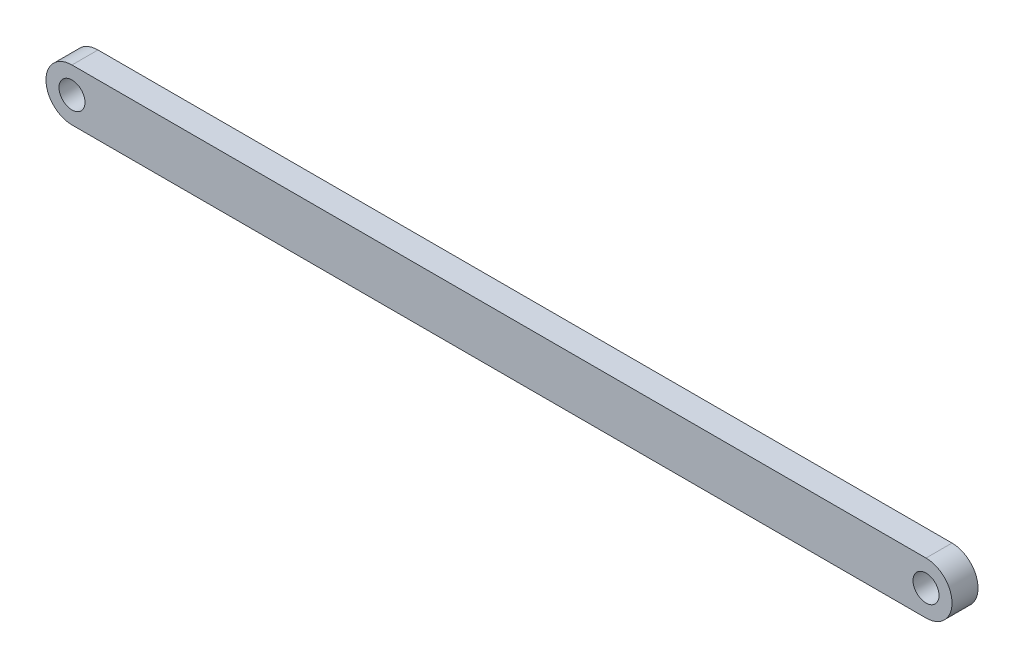
ISO-10303-21;
HEADER;
FILE_DESCRIPTION(('STEP AP214'),'2;1');
FILE_NAME('part.step','',(''),(''),'','','');
FILE_SCHEMA(('AUTOMOTIVE_DESIGN { 1 0 10303 214 1 1 1 1 }'));
ENDSEC;
DATA;
#1=APPLICATION_CONTEXT('core data for automotive mechanical design processes');
#2=APPLICATION_PROTOCOL_DEFINITION('international standard','automotive_design',2000,#1);
#3=PRODUCT_CONTEXT('',#1,'mechanical');
#4=PRODUCT('Part','Part','',(#3));
#5=PRODUCT_RELATED_PRODUCT_CATEGORY('part','',(#4));
#6=PRODUCT_DEFINITION_FORMATION('','',#4);
#7=PRODUCT_DEFINITION_CONTEXT('part definition',#1,'design');
#8=PRODUCT_DEFINITION('design','',#6,#7);
#9=PRODUCT_DEFINITION_SHAPE('','',#8);
#10=(LENGTH_UNIT() NAMED_UNIT(*) SI_UNIT(.MILLI.,.METRE.));
#11=(NAMED_UNIT(*) PLANE_ANGLE_UNIT() SI_UNIT($,.RADIAN.));
#12=(NAMED_UNIT(*) SI_UNIT($,.STERADIAN.) SOLID_ANGLE_UNIT());
#13=UNCERTAINTY_MEASURE_WITH_UNIT(LENGTH_MEASURE(1.E-05),#10,'distance_accuracy_value','');
#14=(GEOMETRIC_REPRESENTATION_CONTEXT(3) GLOBAL_UNCERTAINTY_ASSIGNED_CONTEXT((#13)) GLOBAL_UNIT_ASSIGNED_CONTEXT((#10,
#11,#12)) REPRESENTATION_CONTEXT('',''));
#15=CARTESIAN_POINT('',(0.,0.,0.));
#16=DIRECTION('',(0.,0.,1.));
#17=DIRECTION('',(1.,0.,0.));
#18=AXIS2_PLACEMENT_3D('',#15,#16,#17);
#19=CARTESIAN_POINT('',(82.16,2.06151958209691,5.));
#20=DIRECTION('',(0.,0.,-1.));
#21=DIRECTION('',(-1.,0.,0.));
#22=AXIS2_PLACEMENT_3D('',#19,#20,#21);
#23=PLANE('',#22);
#24=CARTESIAN_POINT('',(82.16,2.06151958209691,5.));
#25=DIRECTION('',(0.,0.,1.));
#26=DIRECTION('',(-1.,0.,0.));
#27=AXIS2_PLACEMENT_3D('',#24,#25,#26);
#28=CIRCLE('',#27,5.00000000000002);
#29=CARTESIAN_POINT('',(82.16,-2.93848041790315,5.));
#30=VERTEX_POINT('',#29);
#31=CARTESIAN_POINT('',(82.16,7.06151958209688,5.));
#32=VERTEX_POINT('',#31);
#33=EDGE_CURVE('E96',#30,#32,#28,.T.);
#34=ORIENTED_EDGE('',*,*,#33,.T.);
#35=DIRECTION('',(-1.,0.,0.));
#36=VECTOR('',#35,1.);
#37=CARTESIAN_POINT('',(-82.16,7.06151958209688,5.));
#38=LINE('',#37,#36);
#39=CARTESIAN_POINT('',(-82.16,7.06151958209688,5.));
#40=VERTEX_POINT('',#39);
#41=EDGE_CURVE('E91',#32,#40,#38,.T.);
#42=ORIENTED_EDGE('',*,*,#41,.T.);
#43=CARTESIAN_POINT('',(-82.16,2.06151958209688,5.));
#44=DIRECTION('',(0.,0.,1.));
#45=DIRECTION('',(1.,0.,0.));
#46=AXIS2_PLACEMENT_3D('',#43,#44,#45);
#47=CIRCLE('',#46,5.00000000000003);
#48=CARTESIAN_POINT('',(-82.16,-2.93848041790315,5.));
#49=VERTEX_POINT('',#48);
#50=EDGE_CURVE('E94',#40,#49,#47,.T.);
#51=ORIENTED_EDGE('',*,*,#50,.T.);
#52=DIRECTION('',(1.,0.,0.));
#53=VECTOR('',#52,1.);
#54=CARTESIAN_POINT('',(-82.16,-2.93848041790318,5.));
#55=LINE('',#54,#53);
#56=EDGE_CURVE('E61',#49,#30,#55,.T.);
#57=ORIENTED_EDGE('',*,*,#56,.T.);
#58=EDGE_LOOP('',(#34,#42,#51,#57));
#59=FACE_BOUND('',#58,.T.);
#60=CARTESIAN_POINT('',(-82.16,2.06151958209688,5.));
#61=DIRECTION('',(0.,0.,1.));
#62=DIRECTION('',(1.,0.,0.));
#63=AXIS2_PLACEMENT_3D('',#60,#61,#62);
#64=CIRCLE('',#63,2.50000000000001);
#65=CARTESIAN_POINT('',(-79.66,2.06151958209688,5.));
#66=VERTEX_POINT('',#65);
#67=EDGE_CURVE('E116',#66,#66,#64,.T.);
#68=ORIENTED_EDGE('',*,*,#67,.F.);
#69=EDGE_LOOP('',(#68));
#70=FACE_BOUND('',#69,.T.);
#71=CARTESIAN_POINT('',(82.16,2.06151958209691,5.));
#72=DIRECTION('',(0.,0.,1.));
#73=DIRECTION('',(1.,0.,0.));
#74=AXIS2_PLACEMENT_3D('',#71,#72,#73);
#75=CIRCLE('',#74,2.50000000000001);
#76=CARTESIAN_POINT('',(84.66,2.06151958209691,5.));
#77=VERTEX_POINT('',#76);
#78=EDGE_CURVE('E138',#77,#77,#75,.T.);
#79=ORIENTED_EDGE('',*,*,#78,.F.);
#80=EDGE_LOOP('',(#79));
#81=FACE_BOUND('',#80,.T.);
#82=ADVANCED_FACE('F43',(#59,#70,#81),#23,.F.);
#83=CARTESIAN_POINT('',(82.16,2.06151958209691,0.));
#84=DIRECTION('',(0.,0.,-1.));
#85=DIRECTION('',(-1.,0.,0.));
#86=AXIS2_PLACEMENT_3D('',#83,#84,#85);
#87=PLANE('',#86);
#88=CARTESIAN_POINT('',(-82.16,2.06151958209688,0.));
#89=DIRECTION('',(0.,0.,1.));
#90=DIRECTION('',(1.,0.,0.));
#91=AXIS2_PLACEMENT_3D('',#88,#89,#90);
#92=CIRCLE('',#91,2.50000000000001);
#93=CARTESIAN_POINT('',(-79.66,2.06151958209688,0.));
#94=VERTEX_POINT('',#93);
#95=EDGE_CURVE('E134',#94,#94,#92,.T.);
#96=ORIENTED_EDGE('',*,*,#95,.T.);
#97=EDGE_LOOP('',(#96));
#98=FACE_BOUND('',#97,.T.);
#99=CARTESIAN_POINT('',(82.16,2.06151958209691,0.));
#100=DIRECTION('',(0.,0.,1.));
#101=DIRECTION('',(-1.,0.,0.));
#102=AXIS2_PLACEMENT_3D('',#99,#100,#101);
#103=CIRCLE('',#102,5.00000000000002);
#104=CARTESIAN_POINT('',(82.16,-2.93848041790315,0.));
#105=VERTEX_POINT('',#104);
#106=CARTESIAN_POINT('',(82.16,7.06151958209688,0.));
#107=VERTEX_POINT('',#106);
#108=EDGE_CURVE('E112',#105,#107,#103,.T.);
#109=ORIENTED_EDGE('',*,*,#108,.F.);
#110=DIRECTION('',(1.,0.,0.));
#111=VECTOR('',#110,1.);
#112=CARTESIAN_POINT('',(-82.16,-2.93848041790318,0.));
#113=LINE('',#112,#111);
#114=CARTESIAN_POINT('',(-82.16,-2.93848041790315,0.));
#115=VERTEX_POINT('',#114);
#116=EDGE_CURVE('E84',#115,#105,#113,.T.);
#117=ORIENTED_EDGE('',*,*,#116,.F.);
#118=CARTESIAN_POINT('',(-82.16,2.06151958209688,0.));
#119=DIRECTION('',(0.,0.,1.));
#120=DIRECTION('',(1.,0.,0.));
#121=AXIS2_PLACEMENT_3D('',#118,#119,#120);
#122=CIRCLE('',#121,5.00000000000003);
#123=CARTESIAN_POINT('',(-82.16,7.06151958209688,0.));
#124=VERTEX_POINT('',#123);
#125=EDGE_CURVE('E78',#124,#115,#122,.T.);
#126=ORIENTED_EDGE('',*,*,#125,.F.);
#127=DIRECTION('',(-1.,0.,0.));
#128=VECTOR('',#127,1.);
#129=CARTESIAN_POINT('',(-82.16,7.06151958209688,0.));
#130=LINE('',#129,#128);
#131=EDGE_CURVE('E101',#107,#124,#130,.T.);
#132=ORIENTED_EDGE('',*,*,#131,.F.);
#133=EDGE_LOOP('',(#109,#117,#126,#132));
#134=FACE_BOUND('',#133,.T.);
#135=CARTESIAN_POINT('',(82.16,2.06151958209691,0.));
#136=DIRECTION('',(0.,0.,1.));
#137=DIRECTION('',(1.,0.,0.));
#138=AXIS2_PLACEMENT_3D('',#135,#136,#137);
#139=CIRCLE('',#138,2.50000000000001);
#140=CARTESIAN_POINT('',(84.66,2.06151958209691,0.));
#141=VERTEX_POINT('',#140);
#142=EDGE_CURVE('E142',#141,#141,#139,.T.);
#143=ORIENTED_EDGE('',*,*,#142,.T.);
#144=EDGE_LOOP('',(#143));
#145=FACE_BOUND('',#144,.T.);
#146=ADVANCED_FACE('F129',(#98,#134,#145),#87,.T.);
#147=CARTESIAN_POINT('',(82.16,2.06151958209691,5.));
#148=DIRECTION('',(0.,0.,-1.));
#149=DIRECTION('',(-1.,0.,0.));
#150=AXIS2_PLACEMENT_3D('',#147,#148,#149);
#151=CYLINDRICAL_SURFACE('',#150,5.00000000000002);
#152=ORIENTED_EDGE('',*,*,#108,.T.);
#153=DIRECTION('',(0.,0.,-1.));
#154=VECTOR('',#153,1.);
#155=CARTESIAN_POINT('',(82.16,7.06151958209688,5.));
#156=LINE('',#155,#154);
#157=EDGE_CURVE('E11',#32,#107,#156,.T.);
#158=ORIENTED_EDGE('',*,*,#157,.F.);
#159=ORIENTED_EDGE('',*,*,#33,.F.);
#160=DIRECTION('',(0.,0.,-1.));
#161=VECTOR('',#160,1.);
#162=CARTESIAN_POINT('',(82.16,-2.93848041790315,5.));
#163=LINE('',#162,#161);
#164=EDGE_CURVE('E108',#30,#105,#163,.T.);
#165=ORIENTED_EDGE('',*,*,#164,.T.);
#166=EDGE_LOOP('',(#152,#158,#159,#165));
#167=FACE_BOUND('',#166,.T.);
#168=ADVANCED_FACE('F45',(#167),#151,.T.);
#169=CARTESIAN_POINT('',(-82.16,7.06151958209688,5.));
#170=DIRECTION('',(0.,-1.,0.));
#171=DIRECTION('',(0.,0.,-1.));
#172=AXIS2_PLACEMENT_3D('',#169,#170,#171);
#173=PLANE('',#172);
#174=ORIENTED_EDGE('',*,*,#131,.T.);
#175=DIRECTION('',(0.,0.,-1.));
#176=VECTOR('',#175,1.);
#177=CARTESIAN_POINT('',(-82.16,7.06151958209688,5.));
#178=LINE('',#177,#176);
#179=EDGE_CURVE('E53',#40,#124,#178,.T.);
#180=ORIENTED_EDGE('',*,*,#179,.F.);
#181=ORIENTED_EDGE('',*,*,#41,.F.);
#182=ORIENTED_EDGE('',*,*,#157,.T.);
#183=EDGE_LOOP('',(#174,#180,#181,#182));
#184=FACE_BOUND('',#183,.T.);
#185=ADVANCED_FACE('F100',(#184),#173,.F.);
#186=CARTESIAN_POINT('',(-82.16,2.06151958209688,5.));
#187=DIRECTION('',(0.,0.,-1.));
#188=DIRECTION('',(-1.,0.,0.));
#189=AXIS2_PLACEMENT_3D('',#186,#187,#188);
#190=CYLINDRICAL_SURFACE('',#189,5.00000000000003);
#191=ORIENTED_EDGE('',*,*,#125,.T.);
#192=DIRECTION('',(0.,0.,-1.));
#193=VECTOR('',#192,1.);
#194=CARTESIAN_POINT('',(-82.16,-2.93848041790315,5.));
#195=LINE('',#194,#193);
#196=EDGE_CURVE('E103',#49,#115,#195,.T.);
#197=ORIENTED_EDGE('',*,*,#196,.F.);
#198=ORIENTED_EDGE('',*,*,#50,.F.);
#199=ORIENTED_EDGE('',*,*,#179,.T.);
#200=EDGE_LOOP('',(#191,#197,#198,#199));
#201=FACE_BOUND('',#200,.T.);
#202=ADVANCED_FACE('F104',(#201),#190,.T.);
#203=CARTESIAN_POINT('',(-82.16,-2.93848041790318,5.));
#204=DIRECTION('',(0.,1.,0.));
#205=DIRECTION('',(-1.,0.,0.));
#206=AXIS2_PLACEMENT_3D('',#203,#204,#205);
#207=PLANE('',#206);
#208=ORIENTED_EDGE('',*,*,#116,.T.);
#209=ORIENTED_EDGE('',*,*,#164,.F.);
#210=ORIENTED_EDGE('',*,*,#56,.F.);
#211=ORIENTED_EDGE('',*,*,#196,.T.);
#212=EDGE_LOOP('',(#208,#209,#210,#211));
#213=FACE_BOUND('',#212,.T.);
#214=ADVANCED_FACE('F126',(#213),#207,.F.);
#215=CARTESIAN_POINT('',(-82.16,2.06151958209688,5.));
#216=DIRECTION('',(0.,0.,-1.));
#217=DIRECTION('',(-1.,0.,0.));
#218=AXIS2_PLACEMENT_3D('',#215,#216,#217);
#219=CYLINDRICAL_SURFACE('',#218,2.50000000000001);
#220=ORIENTED_EDGE('',*,*,#67,.T.);
#221=EDGE_LOOP('',(#220));
#222=FACE_BOUND('',#221,.T.);
#223=ORIENTED_EDGE('',*,*,#95,.F.);
#224=EDGE_LOOP('',(#223));
#225=FACE_BOUND('',#224,.T.);
#226=ADVANCED_FACE('F161',(#222,#225),#219,.F.);
#227=CARTESIAN_POINT('',(82.16,2.06151958209691,5.));
#228=DIRECTION('',(0.,0.,-1.));
#229=DIRECTION('',(-1.,0.,0.));
#230=AXIS2_PLACEMENT_3D('',#227,#228,#229);
#231=CYLINDRICAL_SURFACE('',#230,2.50000000000001);
#232=ORIENTED_EDGE('',*,*,#78,.T.);
#233=EDGE_LOOP('',(#232));
#234=FACE_BOUND('',#233,.T.);
#235=ORIENTED_EDGE('',*,*,#142,.F.);
#236=EDGE_LOOP('',(#235));
#237=FACE_BOUND('',#236,.T.);
#238=ADVANCED_FACE('F150',(#234,#237),#231,.F.);
#239=CLOSED_SHELL('',(#82,#146,#168,#185,#202,#214,#226,#238));
#240=MANIFOLD_SOLID_BREP('B2',#239);
#241=ADVANCED_BREP_SHAPE_REPRESENTATION('',(#18,#240),#14);
#242=SHAPE_DEFINITION_REPRESENTATION(#9,#241);
ENDSEC;
END-ISO-10303-21;
